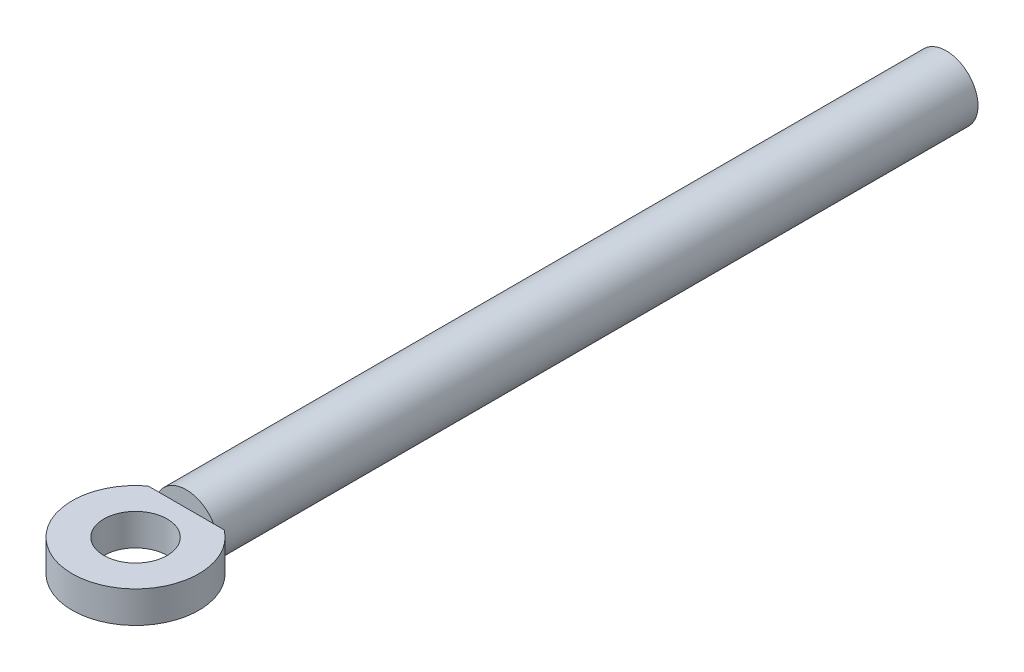
ISO-10303-21;
HEADER;
FILE_DESCRIPTION(('STEP AP214'),'2;1');
FILE_NAME('part.step','',(''),(''),'','','');
FILE_SCHEMA(('AUTOMOTIVE_DESIGN { 1 0 10303 214 1 1 1 1 }'));
ENDSEC;
DATA;
#1=APPLICATION_CONTEXT('core data for automotive mechanical design processes');
#2=APPLICATION_PROTOCOL_DEFINITION('international standard','automotive_design',2000,#1);
#3=PRODUCT_CONTEXT('',#1,'mechanical');
#4=PRODUCT('Part','Part','',(#3));
#5=PRODUCT_RELATED_PRODUCT_CATEGORY('part','',(#4));
#6=PRODUCT_DEFINITION_FORMATION('','',#4);
#7=PRODUCT_DEFINITION_CONTEXT('part definition',#1,'design');
#8=PRODUCT_DEFINITION('design','',#6,#7);
#9=PRODUCT_DEFINITION_SHAPE('','',#8);
#10=(LENGTH_UNIT() NAMED_UNIT(*) SI_UNIT(.MILLI.,.METRE.));
#11=(NAMED_UNIT(*) PLANE_ANGLE_UNIT() SI_UNIT($,.RADIAN.));
#12=(NAMED_UNIT(*) SI_UNIT($,.STERADIAN.) SOLID_ANGLE_UNIT());
#13=UNCERTAINTY_MEASURE_WITH_UNIT(LENGTH_MEASURE(1.E-05),#10,'distance_accuracy_value','');
#14=(GEOMETRIC_REPRESENTATION_CONTEXT(3) GLOBAL_UNCERTAINTY_ASSIGNED_CONTEXT((#13)) GLOBAL_UNIT_ASSIGNED_CONTEXT((#10,
#11,#12)) REPRESENTATION_CONTEXT('',''));
#15=CARTESIAN_POINT('',(0.,0.,0.));
#16=DIRECTION('',(0.,0.,1.));
#17=DIRECTION('',(1.,0.,0.));
#18=AXIS2_PLACEMENT_3D('',#15,#16,#17);
#19=CARTESIAN_POINT('',(12.7,-3.175,175.26));
#20=DIRECTION('',(0.,1.,0.));
#21=DIRECTION('',(-1.,0.,0.));
#22=AXIS2_PLACEMENT_3D('',#19,#20,#21);
#23=PLANE('',#22);
#24=CARTESIAN_POINT('',(0.,-3.175,162.56));
#25=DIRECTION('',(0.,1.,0.));
#26=DIRECTION('',(-1.,0.,0.));
#27=AXIS2_PLACEMENT_3D('',#24,#25,#26);
#28=CIRCLE('',#27,6.35);
#29=CARTESIAN_POINT('',(-6.35,-3.175,162.56));
#30=VERTEX_POINT('',#29);
#31=EDGE_CURVE('E138',#30,#30,#28,.T.);
#32=ORIENTED_EDGE('',*,*,#31,.T.);
#33=EDGE_LOOP('',(#32));
#34=FACE_BOUND('',#33,.T.);
#35=DIRECTION('',(1.,0.,0.));
#36=VECTOR('',#35,1.);
#37=CARTESIAN_POINT('',(12.7,-3.175,152.4));
#38=LINE('',#37,#36);
#39=CARTESIAN_POINT('',(5.49926131403118,-3.175,152.4));
#40=VERTEX_POINT('',#39);
#41=CARTESIAN_POINT('',(7.61999999999998,-3.175,152.4));
#42=VERTEX_POINT('',#41);
#43=EDGE_CURVE('E157',#40,#42,#38,.T.);
#44=ORIENTED_EDGE('',*,*,#43,.T.);
#45=CARTESIAN_POINT('',(0.,-3.175,162.56));
#46=DIRECTION('',(0.,1.,0.));
#47=DIRECTION('',(-1.,0.,0.));
#48=AXIS2_PLACEMENT_3D('',#45,#46,#47);
#49=CIRCLE('',#48,12.7);
#50=CARTESIAN_POINT('',(-7.61999999999998,-3.175,152.4));
#51=VERTEX_POINT('',#50);
#52=EDGE_CURVE('E142',#51,#42,#49,.T.);
#53=ORIENTED_EDGE('',*,*,#52,.F.);
#54=CARTESIAN_POINT('',(-5.49926131403118,-3.175,152.4));
#55=VERTEX_POINT('',#54);
#56=EDGE_CURVE('E98',#51,#55,#38,.T.);
#57=ORIENTED_EDGE('',*,*,#56,.T.);
#58=EDGE_CURVE('E155',#55,#40,#38,.T.);
#59=ORIENTED_EDGE('',*,*,#58,.T.);
#60=EDGE_LOOP('',(#44,#53,#57,#59));
#61=FACE_BOUND('',#60,.T.);
#62=ADVANCED_FACE('F83',(#34,#61),#23,.F.);
#63=CARTESIAN_POINT('',(12.7,3.175,175.26));
#64=DIRECTION('',(0.,-1.,0.));
#65=DIRECTION('',(1.,0.,0.));
#66=AXIS2_PLACEMENT_3D('',#63,#64,#65);
#67=PLANE('',#66);
#68=CARTESIAN_POINT('',(0.,3.175,162.56));
#69=DIRECTION('',(0.,1.,0.));
#70=DIRECTION('',(-1.,0.,0.));
#71=AXIS2_PLACEMENT_3D('',#68,#69,#70);
#72=CIRCLE('',#71,6.35);
#73=CARTESIAN_POINT('',(-6.35,3.175,162.56));
#74=VERTEX_POINT('',#73);
#75=EDGE_CURVE('E163',#74,#74,#72,.T.);
#76=ORIENTED_EDGE('',*,*,#75,.F.);
#77=EDGE_LOOP('',(#76));
#78=FACE_BOUND('',#77,.T.);
#79=CARTESIAN_POINT('',(0.,3.175,162.56));
#80=DIRECTION('',(0.,1.,0.));
#81=DIRECTION('',(-1.,0.,0.));
#82=AXIS2_PLACEMENT_3D('',#79,#80,#81);
#83=CIRCLE('',#82,12.7);
#84=CARTESIAN_POINT('',(-7.61999999999998,3.175,152.4));
#85=VERTEX_POINT('',#84);
#86=CARTESIAN_POINT('',(7.61999999999998,3.175,152.4));
#87=VERTEX_POINT('',#86);
#88=EDGE_CURVE('E127',#85,#87,#83,.T.);
#89=ORIENTED_EDGE('',*,*,#88,.T.);
#90=DIRECTION('',(-1.,0.,0.));
#91=VECTOR('',#90,1.);
#92=CARTESIAN_POINT('',(12.7,3.175,152.4));
#93=LINE('',#92,#91);
#94=CARTESIAN_POINT('',(5.49926131403118,3.175,152.4));
#95=VERTEX_POINT('',#94);
#96=EDGE_CURVE('E131',#87,#95,#93,.T.);
#97=ORIENTED_EDGE('',*,*,#96,.T.);
#98=CARTESIAN_POINT('',(-5.49926131403118,3.175,152.4));
#99=VERTEX_POINT('',#98);
#100=EDGE_CURVE('E91',#95,#99,#93,.T.);
#101=ORIENTED_EDGE('',*,*,#100,.T.);
#102=EDGE_CURVE('E134',#99,#85,#93,.T.);
#103=ORIENTED_EDGE('',*,*,#102,.T.);
#104=EDGE_LOOP('',(#89,#97,#101,#103));
#105=FACE_BOUND('',#104,.T.);
#106=ADVANCED_FACE('F128',(#78,#105),#67,.F.);
#107=CARTESIAN_POINT('',(0.,0.,152.4));
#108=DIRECTION('',(0.,0.,1.));
#109=DIRECTION('',(1.,0.,0.));
#110=AXIS2_PLACEMENT_3D('',#107,#108,#109);
#111=PLANE('',#110);
#112=DIRECTION('',(0.,1.,0.));
#113=VECTOR('',#112,1.);
#114=CARTESIAN_POINT('',(7.61999999999998,-19.685,152.4));
#115=LINE('',#114,#113);
#116=EDGE_CURVE('E12',#42,#87,#115,.T.);
#117=ORIENTED_EDGE('',*,*,#116,.F.);
#118=ORIENTED_EDGE('',*,*,#43,.F.);
#119=CARTESIAN_POINT('',(0.,0.,152.4));
#120=DIRECTION('',(0.,0.,1.));
#121=DIRECTION('',(1.,0.,0.));
#122=AXIS2_PLACEMENT_3D('',#119,#120,#121);
#123=CIRCLE('',#122,6.35);
#124=EDGE_CURVE('E149',#40,#95,#123,.T.);
#125=ORIENTED_EDGE('',*,*,#124,.T.);
#126=ORIENTED_EDGE('',*,*,#96,.F.);
#127=EDGE_LOOP('',(#117,#118,#125,#126));
#128=FACE_BOUND('',#127,.T.);
#129=ADVANCED_FACE('F147',(#128),#111,.F.);
#130=DIRECTION('',(0.,1.,0.));
#131=VECTOR('',#130,1.);
#132=CARTESIAN_POINT('',(-7.61999999999997,-19.685,152.4));
#133=LINE('',#132,#131);
#134=EDGE_CURVE('E137',#51,#85,#133,.T.);
#135=ORIENTED_EDGE('',*,*,#134,.T.);
#136=ORIENTED_EDGE('',*,*,#102,.F.);
#137=EDGE_CURVE('E106',#99,#55,#123,.T.);
#138=ORIENTED_EDGE('',*,*,#137,.T.);
#139=ORIENTED_EDGE('',*,*,#56,.F.);
#140=EDGE_LOOP('',(#135,#136,#138,#139));
#141=FACE_BOUND('',#140,.T.);
#142=ADVANCED_FACE('F176',(#141),#111,.F.);
#143=CARTESIAN_POINT('',(0.,0.,152.4));
#144=DIRECTION('',(0.,0.,1.));
#145=DIRECTION('',(1.,0.,0.));
#146=AXIS2_PLACEMENT_3D('',#143,#144,#145);
#147=PLANE('',#146);
#148=ORIENTED_EDGE('',*,*,#100,.F.);
#149=EDGE_CURVE('E156',#95,#99,#123,.T.);
#150=ORIENTED_EDGE('',*,*,#149,.T.);
#151=EDGE_LOOP('',(#148,#150));
#152=FACE_BOUND('',#151,.T.);
#153=ADVANCED_FACE('F186',(#152),#147,.T.);
#154=CARTESIAN_POINT('',(0.,0.,152.4));
#155=DIRECTION('',(0.,0.,-1.));
#156=DIRECTION('',(-1.,0.,0.));
#157=AXIS2_PLACEMENT_3D('',#154,#155,#156);
#158=CYLINDRICAL_SURFACE('',#157,6.35);
#159=ORIENTED_EDGE('',*,*,#149,.F.);
#160=ORIENTED_EDGE('',*,*,#124,.F.);
#161=EDGE_CURVE('E200',#55,#40,#123,.T.);
#162=ORIENTED_EDGE('',*,*,#161,.F.);
#163=ORIENTED_EDGE('',*,*,#137,.F.);
#164=EDGE_LOOP('',(#159,#160,#162,#163));
#165=FACE_BOUND('',#164,.T.);
#166=CARTESIAN_POINT('',(0.,0.,0.));
#167=DIRECTION('',(0.,0.,1.));
#168=DIRECTION('',(1.,0.,0.));
#169=AXIS2_PLACEMENT_3D('',#166,#167,#168);
#170=CIRCLE('',#169,6.35);
#171=CARTESIAN_POINT('',(6.35,0.,0.));
#172=VERTEX_POINT('',#171);
#173=EDGE_CURVE('E150',#172,#172,#170,.T.);
#174=ORIENTED_EDGE('',*,*,#173,.T.);
#175=EDGE_LOOP('',(#174));
#176=FACE_BOUND('',#175,.T.);
#177=ADVANCED_FACE('F85',(#165,#176),#158,.T.);
#178=ORIENTED_EDGE('',*,*,#58,.F.);
#179=ORIENTED_EDGE('',*,*,#161,.T.);
#180=EDGE_LOOP('',(#178,#179));
#181=FACE_BOUND('',#180,.T.);
#182=ADVANCED_FACE('F182',(#181),#147,.T.);
#183=CARTESIAN_POINT('',(0.,0.,0.));
#184=DIRECTION('',(0.,0.,1.));
#185=DIRECTION('',(1.,0.,0.));
#186=AXIS2_PLACEMENT_3D('',#183,#184,#185);
#187=PLANE('',#186);
#188=ORIENTED_EDGE('',*,*,#173,.F.);
#189=EDGE_LOOP('',(#188));
#190=FACE_BOUND('',#189,.T.);
#191=ADVANCED_FACE('F184',(#190),#187,.F.);
#192=CARTESIAN_POINT('',(0.,-19.685,162.56));
#193=DIRECTION('',(0.,1.,0.));
#194=DIRECTION('',(-1.,0.,0.));
#195=AXIS2_PLACEMENT_3D('',#192,#193,#194);
#196=CYLINDRICAL_SURFACE('',#195,12.7);
#197=ORIENTED_EDGE('',*,*,#52,.T.);
#198=ORIENTED_EDGE('',*,*,#116,.T.);
#199=ORIENTED_EDGE('',*,*,#88,.F.);
#200=ORIENTED_EDGE('',*,*,#134,.F.);
#201=EDGE_LOOP('',(#197,#198,#199,#200));
#202=FACE_BOUND('',#201,.T.);
#203=ADVANCED_FACE('F141',(#202),#196,.T.);
#204=CARTESIAN_POINT('',(0.,-19.685,162.56));
#205=DIRECTION('',(0.,1.,0.));
#206=DIRECTION('',(-1.,0.,0.));
#207=AXIS2_PLACEMENT_3D('',#204,#205,#206);
#208=CYLINDRICAL_SURFACE('',#207,6.35);
#209=ORIENTED_EDGE('',*,*,#75,.T.);
#210=EDGE_LOOP('',(#209));
#211=FACE_BOUND('',#210,.T.);
#212=ORIENTED_EDGE('',*,*,#31,.F.);
#213=EDGE_LOOP('',(#212));
#214=FACE_BOUND('',#213,.T.);
#215=ADVANCED_FACE('F167',(#211,#214),#208,.F.);
#216=CLOSED_SHELL('',(#62,#106,#129,#142,#153,#177,#182,#191,#203,#215));
#217=MANIFOLD_SOLID_BREP('B2',#216);
#218=ADVANCED_BREP_SHAPE_REPRESENTATION('',(#18,#217),#14);
#219=SHAPE_DEFINITION_REPRESENTATION(#9,#218);
ENDSEC;
END-ISO-10303-21;
